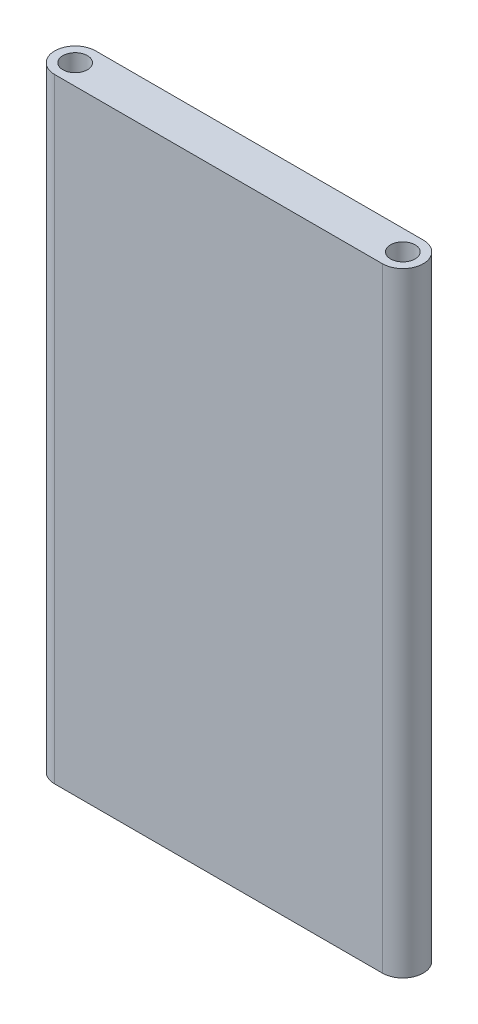
ISO-10303-21;
HEADER;
FILE_DESCRIPTION(('STEP AP214'),'2;1');
FILE_NAME('part.step','',(''),(''),'','','');
FILE_SCHEMA(('AUTOMOTIVE_DESIGN { 1 0 10303 214 1 1 1 1 }'));
ENDSEC;
DATA;
#1=APPLICATION_CONTEXT('core data for automotive mechanical design processes');
#2=APPLICATION_PROTOCOL_DEFINITION('international standard','automotive_design',2000,#1);
#3=PRODUCT_CONTEXT('',#1,'mechanical');
#4=PRODUCT('Part','Part','',(#3));
#5=PRODUCT_RELATED_PRODUCT_CATEGORY('part','',(#4));
#6=PRODUCT_DEFINITION_FORMATION('','',#4);
#7=PRODUCT_DEFINITION_CONTEXT('part definition',#1,'design');
#8=PRODUCT_DEFINITION('design','',#6,#7);
#9=PRODUCT_DEFINITION_SHAPE('','',#8);
#10=(LENGTH_UNIT() NAMED_UNIT(*) SI_UNIT(.MILLI.,.METRE.));
#11=(NAMED_UNIT(*) PLANE_ANGLE_UNIT() SI_UNIT($,.RADIAN.));
#12=(NAMED_UNIT(*) SI_UNIT($,.STERADIAN.) SOLID_ANGLE_UNIT());
#13=UNCERTAINTY_MEASURE_WITH_UNIT(LENGTH_MEASURE(1.E-05),#10,'distance_accuracy_value','');
#14=(GEOMETRIC_REPRESENTATION_CONTEXT(3) GLOBAL_UNCERTAINTY_ASSIGNED_CONTEXT((#13)) GLOBAL_UNIT_ASSIGNED_CONTEXT((#10,
#11,#12)) REPRESENTATION_CONTEXT('',''));
#15=CARTESIAN_POINT('',(0.,0.,0.));
#16=DIRECTION('',(0.,0.,1.));
#17=DIRECTION('',(1.,0.,0.));
#18=AXIS2_PLACEMENT_3D('',#15,#16,#17);
#19=CARTESIAN_POINT('',(-50.8,95.25,0.));
#20=DIRECTION('',(0.,-1.,0.));
#21=DIRECTION('',(0.,0.,-1.));
#22=AXIS2_PLACEMENT_3D('',#19,#20,#21);
#23=PLANE('',#22);
#24=DIRECTION('',(-1.,0.,0.));
#25=VECTOR('',#24,1.);
#26=CARTESIAN_POINT('',(0.,95.25,-6.35));
#27=LINE('',#26,#25);
#28=CARTESIAN_POINT('',(50.8,95.25,-6.35000000000002));
#29=VERTEX_POINT('',#28);
#30=CARTESIAN_POINT('',(-50.8,95.25,-6.34999999999999));
#31=VERTEX_POINT('',#30);
#32=EDGE_CURVE('E53',#29,#31,#27,.T.);
#33=ORIENTED_EDGE('',*,*,#32,.T.);
#34=CARTESIAN_POINT('',(-50.8,95.25,0.));
#35=DIRECTION('',(0.,1.,0.));
#36=DIRECTION('',(0.,0.,-1.));
#37=AXIS2_PLACEMENT_3D('',#34,#35,#36);
#38=CIRCLE('',#37,6.34999999999999);
#39=CARTESIAN_POINT('',(-50.8,95.25,6.34999999999999));
#40=VERTEX_POINT('',#39);
#41=EDGE_CURVE('E84',#31,#40,#38,.T.);
#42=ORIENTED_EDGE('',*,*,#41,.T.);
#43=DIRECTION('',(1.,0.,0.));
#44=VECTOR('',#43,1.);
#45=CARTESIAN_POINT('',(50.8,95.25,6.34999999999999));
#46=LINE('',#45,#44);
#47=CARTESIAN_POINT('',(50.8,95.25,6.35000000000001));
#48=VERTEX_POINT('',#47);
#49=EDGE_CURVE('E88',#40,#48,#46,.T.);
#50=ORIENTED_EDGE('',*,*,#49,.T.);
#51=CARTESIAN_POINT('',(50.8,95.25,0.));
#52=DIRECTION('',(0.,1.,0.));
#53=DIRECTION('',(0.,0.,1.));
#54=AXIS2_PLACEMENT_3D('',#51,#52,#53);
#55=CIRCLE('',#54,6.35000000000001);
#56=EDGE_CURVE('E95',#48,#29,#55,.T.);
#57=ORIENTED_EDGE('',*,*,#56,.T.);
#58=EDGE_LOOP('',(#33,#42,#50,#57));
#59=FACE_BOUND('',#58,.T.);
#60=CARTESIAN_POINT('',(-50.8,95.25,0.));
#61=DIRECTION('',(0.,1.,0.));
#62=DIRECTION('',(0.,0.,1.));
#63=AXIS2_PLACEMENT_3D('',#60,#61,#62);
#64=CIRCLE('',#63,3.81);
#65=CARTESIAN_POINT('',(-50.8,95.25,3.81));
#66=VERTEX_POINT('',#65);
#67=EDGE_CURVE('E102',#66,#66,#64,.T.);
#68=ORIENTED_EDGE('',*,*,#67,.F.);
#69=EDGE_LOOP('',(#68));
#70=FACE_BOUND('',#69,.T.);
#71=CARTESIAN_POINT('',(50.8,95.25,0.));
#72=DIRECTION('',(0.,1.,0.));
#73=DIRECTION('',(0.,0.,-1.));
#74=AXIS2_PLACEMENT_3D('',#71,#72,#73);
#75=CIRCLE('',#74,3.81);
#76=CARTESIAN_POINT('',(50.8,95.25,-3.81));
#77=VERTEX_POINT('',#76);
#78=EDGE_CURVE('E140',#77,#77,#75,.T.);
#79=ORIENTED_EDGE('',*,*,#78,.F.);
#80=EDGE_LOOP('',(#79));
#81=FACE_BOUND('',#80,.T.);
#82=ADVANCED_FACE('F36',(#59,#70,#81),#23,.F.);
#83=CARTESIAN_POINT('',(-50.8,-95.25,0.));
#84=DIRECTION('',(0.,-1.,0.));
#85=DIRECTION('',(0.,0.,-1.));
#86=AXIS2_PLACEMENT_3D('',#83,#84,#85);
#87=PLANE('',#86);
#88=CARTESIAN_POINT('',(-50.8,-95.25,0.));
#89=DIRECTION('',(0.,1.,0.));
#90=DIRECTION('',(0.,0.,1.));
#91=AXIS2_PLACEMENT_3D('',#88,#89,#90);
#92=CIRCLE('',#91,3.81);
#93=CARTESIAN_POINT('',(-50.8,-95.25,3.81));
#94=VERTEX_POINT('',#93);
#95=EDGE_CURVE('E145',#94,#94,#92,.T.);
#96=ORIENTED_EDGE('',*,*,#95,.T.);
#97=EDGE_LOOP('',(#96));
#98=FACE_BOUND('',#97,.T.);
#99=CARTESIAN_POINT('',(-50.8,-95.25,0.));
#100=DIRECTION('',(0.,1.,0.));
#101=DIRECTION('',(0.,0.,-1.));
#102=AXIS2_PLACEMENT_3D('',#99,#100,#101);
#103=CIRCLE('',#102,6.34999999999999);
#104=CARTESIAN_POINT('',(-50.8,-95.25,-6.34999999999999));
#105=VERTEX_POINT('',#104);
#106=CARTESIAN_POINT('',(-50.8,-95.25,6.34999999999999));
#107=VERTEX_POINT('',#106);
#108=EDGE_CURVE('E91',#105,#107,#103,.T.);
#109=ORIENTED_EDGE('',*,*,#108,.F.);
#110=DIRECTION('',(-1.,0.,0.));
#111=VECTOR('',#110,1.);
#112=CARTESIAN_POINT('',(0.,-95.25,-6.35));
#113=LINE('',#112,#111);
#114=CARTESIAN_POINT('',(50.8,-95.25,-6.35000000000002));
#115=VERTEX_POINT('',#114);
#116=EDGE_CURVE('E105',#115,#105,#113,.T.);
#117=ORIENTED_EDGE('',*,*,#116,.F.);
#118=CARTESIAN_POINT('',(50.8,-95.25,0.));
#119=DIRECTION('',(0.,1.,0.));
#120=DIRECTION('',(0.,0.,1.));
#121=AXIS2_PLACEMENT_3D('',#118,#119,#120);
#122=CIRCLE('',#121,6.35000000000001);
#123=CARTESIAN_POINT('',(50.8,-95.25,6.35000000000001));
#124=VERTEX_POINT('',#123);
#125=EDGE_CURVE('E78',#124,#115,#122,.T.);
#126=ORIENTED_EDGE('',*,*,#125,.F.);
#127=DIRECTION('',(1.,0.,0.));
#128=VECTOR('',#127,1.);
#129=CARTESIAN_POINT('',(50.8,-95.25,6.34999999999999));
#130=LINE('',#129,#128);
#131=EDGE_CURVE('E71',#107,#124,#130,.T.);
#132=ORIENTED_EDGE('',*,*,#131,.F.);
#133=EDGE_LOOP('',(#109,#117,#126,#132));
#134=FACE_BOUND('',#133,.T.);
#135=CARTESIAN_POINT('',(50.8,-95.25,0.));
#136=DIRECTION('',(0.,1.,0.));
#137=DIRECTION('',(0.,0.,-1.));
#138=AXIS2_PLACEMENT_3D('',#135,#136,#137);
#139=CIRCLE('',#138,3.81);
#140=CARTESIAN_POINT('',(50.8,-95.25,-3.81));
#141=VERTEX_POINT('',#140);
#142=EDGE_CURVE('E143',#141,#141,#139,.T.);
#143=ORIENTED_EDGE('',*,*,#142,.T.);
#144=EDGE_LOOP('',(#143));
#145=FACE_BOUND('',#144,.T.);
#146=ADVANCED_FACE('F111',(#98,#134,#145),#87,.T.);
#147=CARTESIAN_POINT('',(-50.8,95.25,0.));
#148=DIRECTION('',(0.,-1.,0.));
#149=DIRECTION('',(0.,0.,-1.));
#150=AXIS2_PLACEMENT_3D('',#147,#148,#149);
#151=CYLINDRICAL_SURFACE('',#150,6.34999999999999);
#152=ORIENTED_EDGE('',*,*,#108,.T.);
#153=DIRECTION('',(0.,-1.,0.));
#154=VECTOR('',#153,1.);
#155=CARTESIAN_POINT('',(-50.8,95.25,6.34999999999999));
#156=LINE('',#155,#154);
#157=EDGE_CURVE('E45',#40,#107,#156,.T.);
#158=ORIENTED_EDGE('',*,*,#157,.F.);
#159=ORIENTED_EDGE('',*,*,#41,.F.);
#160=DIRECTION('',(0.,-1.,0.));
#161=VECTOR('',#160,1.);
#162=CARTESIAN_POINT('',(-50.8,95.25,-6.34999999999999));
#163=LINE('',#162,#161);
#164=EDGE_CURVE('E11',#31,#105,#163,.T.);
#165=ORIENTED_EDGE('',*,*,#164,.T.);
#166=EDGE_LOOP('',(#152,#158,#159,#165));
#167=FACE_BOUND('',#166,.T.);
#168=ADVANCED_FACE('F38',(#167),#151,.T.);
#169=CARTESIAN_POINT('',(50.8,95.25,6.34999999999999));
#170=DIRECTION('',(0.,0.,-1.));
#171=DIRECTION('',(-1.,0.,0.));
#172=AXIS2_PLACEMENT_3D('',#169,#170,#171);
#173=PLANE('',#172);
#174=ORIENTED_EDGE('',*,*,#131,.T.);
#175=DIRECTION('',(0.,-1.,0.));
#176=VECTOR('',#175,1.);
#177=CARTESIAN_POINT('',(50.8,95.25,6.35000000000001));
#178=LINE('',#177,#176);
#179=EDGE_CURVE('E92',#48,#124,#178,.T.);
#180=ORIENTED_EDGE('',*,*,#179,.F.);
#181=ORIENTED_EDGE('',*,*,#49,.F.);
#182=ORIENTED_EDGE('',*,*,#157,.T.);
#183=EDGE_LOOP('',(#174,#180,#181,#182));
#184=FACE_BOUND('',#183,.T.);
#185=ADVANCED_FACE('F93',(#184),#173,.F.);
#186=CARTESIAN_POINT('',(50.8,95.25,0.));
#187=DIRECTION('',(0.,-1.,0.));
#188=DIRECTION('',(0.,0.,-1.));
#189=AXIS2_PLACEMENT_3D('',#186,#187,#188);
#190=CYLINDRICAL_SURFACE('',#189,6.35000000000001);
#191=ORIENTED_EDGE('',*,*,#125,.T.);
#192=DIRECTION('',(0.,-1.,0.));
#193=VECTOR('',#192,1.);
#194=CARTESIAN_POINT('',(50.8,95.25,-6.35000000000002));
#195=LINE('',#194,#193);
#196=EDGE_CURVE('E97',#29,#115,#195,.T.);
#197=ORIENTED_EDGE('',*,*,#196,.F.);
#198=ORIENTED_EDGE('',*,*,#56,.F.);
#199=ORIENTED_EDGE('',*,*,#179,.T.);
#200=EDGE_LOOP('',(#191,#197,#198,#199));
#201=FACE_BOUND('',#200,.T.);
#202=ADVANCED_FACE('F108',(#201),#190,.T.);
#203=CARTESIAN_POINT('',(0.,95.25,-6.35));
#204=DIRECTION('',(0.,0.,1.));
#205=DIRECTION('',(1.,0.,0.));
#206=AXIS2_PLACEMENT_3D('',#203,#204,#205);
#207=PLANE('',#206);
#208=ORIENTED_EDGE('',*,*,#116,.T.);
#209=ORIENTED_EDGE('',*,*,#164,.F.);
#210=ORIENTED_EDGE('',*,*,#32,.F.);
#211=ORIENTED_EDGE('',*,*,#196,.T.);
#212=EDGE_LOOP('',(#208,#209,#210,#211));
#213=FACE_BOUND('',#212,.T.);
#214=ADVANCED_FACE('F113',(#213),#207,.F.);
#215=CARTESIAN_POINT('',(-50.8,95.25,0.));
#216=DIRECTION('',(0.,-1.,0.));
#217=DIRECTION('',(0.,0.,-1.));
#218=AXIS2_PLACEMENT_3D('',#215,#216,#217);
#219=CYLINDRICAL_SURFACE('',#218,3.81);
#220=ORIENTED_EDGE('',*,*,#67,.T.);
#221=EDGE_LOOP('',(#220));
#222=FACE_BOUND('',#221,.T.);
#223=ORIENTED_EDGE('',*,*,#95,.F.);
#224=EDGE_LOOP('',(#223));
#225=FACE_BOUND('',#224,.T.);
#226=ADVANCED_FACE('F115',(#222,#225),#219,.F.);
#227=CARTESIAN_POINT('',(50.8,95.25,0.));
#228=DIRECTION('',(0.,-1.,0.));
#229=DIRECTION('',(0.,0.,-1.));
#230=AXIS2_PLACEMENT_3D('',#227,#228,#229);
#231=CYLINDRICAL_SURFACE('',#230,3.81);
#232=ORIENTED_EDGE('',*,*,#78,.T.);
#233=EDGE_LOOP('',(#232));
#234=FACE_BOUND('',#233,.T.);
#235=ORIENTED_EDGE('',*,*,#142,.F.);
#236=EDGE_LOOP('',(#235));
#237=FACE_BOUND('',#236,.T.);
#238=ADVANCED_FACE('F121',(#234,#237),#231,.F.);
#239=CLOSED_SHELL('',(#82,#146,#168,#185,#202,#214,#226,#238));
#240=MANIFOLD_SOLID_BREP('B2',#239);
#241=ADVANCED_BREP_SHAPE_REPRESENTATION('',(#18,#240),#14);
#242=SHAPE_DEFINITION_REPRESENTATION(#9,#241);
ENDSEC;
END-ISO-10303-21;
